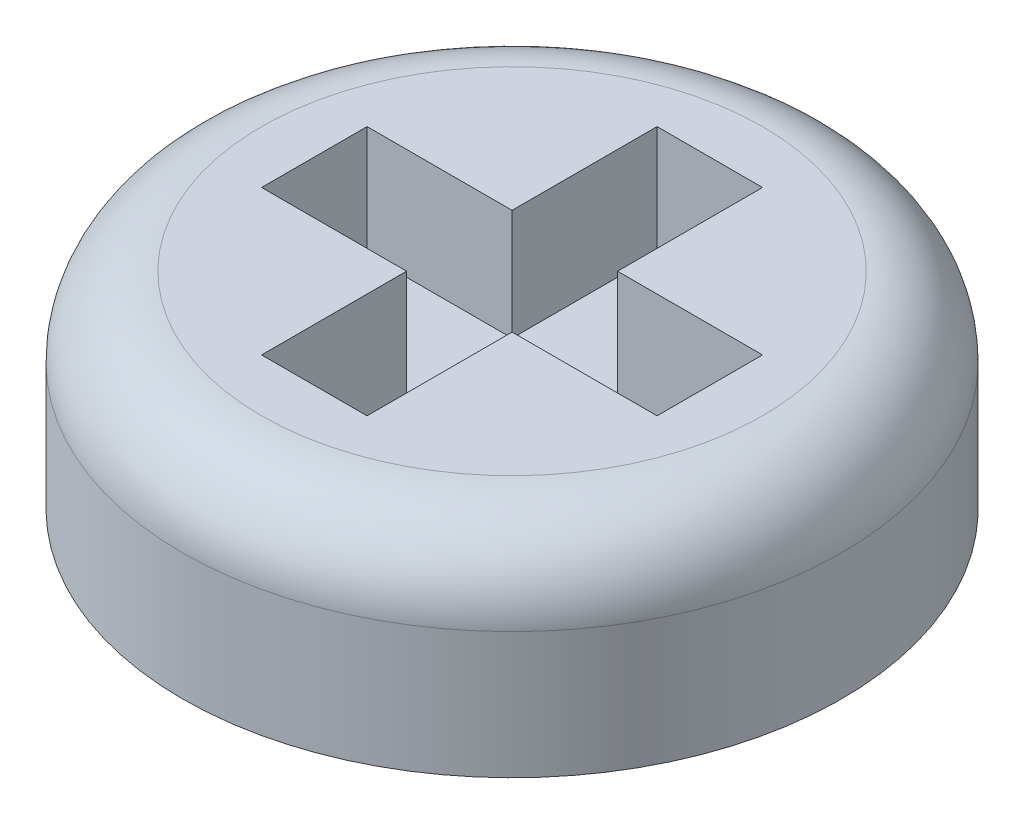
ISO-10303-21;
HEADER;
FILE_DESCRIPTION(('STEP AP214'),'2;1');
FILE_NAME('part.step','',(''),(''),'','','');
FILE_SCHEMA(('AUTOMOTIVE_DESIGN { 1 0 10303 214 1 1 1 1 }'));
ENDSEC;
DATA;
#1=APPLICATION_CONTEXT('core data for automotive mechanical design processes');
#2=APPLICATION_PROTOCOL_DEFINITION('international standard','automotive_design',2000,#1);
#3=PRODUCT_CONTEXT('',#1,'mechanical');
#4=PRODUCT('Part','Part','',(#3));
#5=PRODUCT_RELATED_PRODUCT_CATEGORY('part','',(#4));
#6=PRODUCT_DEFINITION_FORMATION('','',#4);
#7=PRODUCT_DEFINITION_CONTEXT('part definition',#1,'design');
#8=PRODUCT_DEFINITION('design','',#6,#7);
#9=PRODUCT_DEFINITION_SHAPE('','',#8);
#10=(LENGTH_UNIT() NAMED_UNIT(*) SI_UNIT(.MILLI.,.METRE.));
#11=(NAMED_UNIT(*) PLANE_ANGLE_UNIT() SI_UNIT($,.RADIAN.));
#12=(NAMED_UNIT(*) SI_UNIT($,.STERADIAN.) SOLID_ANGLE_UNIT());
#13=UNCERTAINTY_MEASURE_WITH_UNIT(LENGTH_MEASURE(1.E-05),#10,'distance_accuracy_value','');
#14=(GEOMETRIC_REPRESENTATION_CONTEXT(3) GLOBAL_UNCERTAINTY_ASSIGNED_CONTEXT((#13)) GLOBAL_UNIT_ASSIGNED_CONTEXT((#10,
#11,#12)) REPRESENTATION_CONTEXT('',''));
#15=CARTESIAN_POINT('',(0.,0.,0.));
#16=DIRECTION('',(0.,0.,1.));
#17=DIRECTION('',(1.,0.,0.));
#18=AXIS2_PLACEMENT_3D('',#15,#16,#17);
#19=CARTESIAN_POINT('',(0.508,35.0012,1.905));
#20=DIRECTION('',(1.,0.,0.));
#21=DIRECTION('',(0.,1.,0.));
#22=AXIS2_PLACEMENT_3D('',#19,#20,#21);
#23=PLANE('',#22);
#24=DIRECTION('',(-2.54151269345114E-13,0.,-1.));
#25=VECTOR('',#24,1.);
#26=CARTESIAN_POINT('',(0.508000000254,36.068000000254,1.90500000016934));
#27=LINE('',#26,#25);
#28=CARTESIAN_POINT('',(0.508000000169333,36.0680000001693,1.90500000016934));
#29=VERTEX_POINT('',#28);
#30=CARTESIAN_POINT('',(0.508000000169215,36.0680000001693,0.508000000169333));
#31=VERTEX_POINT('',#30);
#32=EDGE_CURVE('E122',#29,#31,#27,.T.);
#33=ORIENTED_EDGE('',*,*,#32,.T.);
#34=DIRECTION('',(0.,1.,0.));
#35=VECTOR('',#34,1.);
#36=CARTESIAN_POINT('',(0.508000000254,35.0012000001693,0.508000000254));
#37=LINE('',#36,#35);
#38=CARTESIAN_POINT('',(0.508000000169215,35.0012000001693,0.508000000169333));
#39=VERTEX_POINT('',#38);
#40=EDGE_CURVE('E110',#39,#31,#37,.T.);
#41=ORIENTED_EDGE('',*,*,#40,.F.);
#42=DIRECTION('',(-2.54151269345114E-13,0.,-1.));
#43=VECTOR('',#42,1.);
#44=CARTESIAN_POINT('',(0.508000000254,35.001200000254,1.90500000016934));
#45=LINE('',#44,#43);
#46=CARTESIAN_POINT('',(0.508000000169333,35.0012000001693,1.90500000016934));
#47=VERTEX_POINT('',#46);
#48=EDGE_CURVE('E121',#47,#39,#45,.T.);
#49=ORIENTED_EDGE('',*,*,#48,.F.);
#50=DIRECTION('',(0.,1.,0.));
#51=VECTOR('',#50,1.);
#52=CARTESIAN_POINT('',(0.508000000254,35.0012000001693,1.905000000254));
#53=LINE('',#52,#51);
#54=EDGE_CURVE('E137',#47,#29,#53,.T.);
#55=ORIENTED_EDGE('',*,*,#54,.T.);
#56=EDGE_LOOP('',(#33,#41,#49,#55));
#57=FACE_BOUND('',#56,.T.);
#58=ADVANCED_FACE('F17',(#57),#23,.F.);
#59=CARTESIAN_POINT('',(0.,36.068,0.));
#60=DIRECTION('',(0.,1.,0.));
#61=DIRECTION('',(1.,0.,0.));
#62=AXIS2_PLACEMENT_3D('',#59,#60,#61);
#63=PLANE('',#62);
#64=DIRECTION('',(2.54071797403481E-13,0.,1.));
#65=VECTOR('',#64,1.);
#66=CARTESIAN_POINT('',(-0.508000000254355,36.068000000254,0.508));
#67=LINE('',#66,#65);
#68=CARTESIAN_POINT('',(-0.508,36.068,0.508));
#69=VERTEX_POINT('',#68);
#70=CARTESIAN_POINT('',(-0.508,36.068,1.905));
#71=VERTEX_POINT('',#70);
#72=EDGE_CURVE('E154',#69,#71,#67,.T.);
#73=ORIENTED_EDGE('',*,*,#72,.F.);
#74=DIRECTION('',(1.,0.,0.));
#75=VECTOR('',#74,1.);
#76=CARTESIAN_POINT('',(-1.905,36.068000000254,0.508000000254));
#77=LINE('',#76,#75);
#78=CARTESIAN_POINT('',(-1.905,36.068,0.508));
#79=VERTEX_POINT('',#78);
#80=EDGE_CURVE('E159',#79,#69,#77,.T.);
#81=ORIENTED_EDGE('',*,*,#80,.F.);
#82=DIRECTION('',(0.,0.,1.));
#83=VECTOR('',#82,1.);
#84=CARTESIAN_POINT('',(-1.905000000254,36.068000000254,-0.508));
#85=LINE('',#84,#83);
#86=CARTESIAN_POINT('',(-1.905,36.068,-0.508));
#87=VERTEX_POINT('',#86);
#88=EDGE_CURVE('E164',#87,#79,#85,.T.);
#89=ORIENTED_EDGE('',*,*,#88,.F.);
#90=DIRECTION('',(-1.,0.,-2.54071797434277E-13));
#91=VECTOR('',#90,1.);
#92=CARTESIAN_POINT('',(-0.508000000169333,36.068000000254,-0.508000000253645));
#93=LINE('',#92,#91);
#94=CARTESIAN_POINT('',(-0.508000000169333,36.0680000001693,-0.508000000169215));
#95=VERTEX_POINT('',#94);
#96=EDGE_CURVE('E169',#95,#87,#93,.T.);
#97=ORIENTED_EDGE('',*,*,#96,.F.);
#98=DIRECTION('',(0.,0.,1.));
#99=VECTOR('',#98,1.);
#100=CARTESIAN_POINT('',(-0.508000000254,36.068000000254,-1.90500000016934));
#101=LINE('',#100,#99);
#102=CARTESIAN_POINT('',(-0.508000000169333,36.0680000001693,-1.90500000016934));
#103=VERTEX_POINT('',#102);
#104=EDGE_CURVE('E174',#103,#95,#101,.T.);
#105=ORIENTED_EDGE('',*,*,#104,.F.);
#106=DIRECTION('',(-1.,0.,2.5417113724577E-13));
#107=VECTOR('',#106,1.);
#108=CARTESIAN_POINT('',(0.508000000169452,36.068000000254,-1.90500000025426));
#109=LINE('',#108,#107);
#110=CARTESIAN_POINT('',(0.508000000169452,36.0680000001693,-1.90500000016942));
#111=VERTEX_POINT('',#110);
#112=EDGE_CURVE('E179',#111,#103,#109,.T.);
#113=ORIENTED_EDGE('',*,*,#112,.F.);
#114=DIRECTION('',(2.54230741286733E-13,0.,-1.));
#115=VECTOR('',#114,1.);
#116=CARTESIAN_POINT('',(0.508000000254,36.068000000254,-0.508000000169333));
#117=LINE('',#116,#115);
#118=CARTESIAN_POINT('',(0.508000000169333,36.0680000001693,-0.508000000169333));
#119=VERTEX_POINT('',#118);
#120=EDGE_CURVE('E184',#119,#111,#117,.T.);
#121=ORIENTED_EDGE('',*,*,#120,.F.);
#122=DIRECTION('',(-1.,0.,2.5407179740348E-13));
#123=VECTOR('',#122,1.);
#124=CARTESIAN_POINT('',(1.90500000016934,36.068000000254,-0.508000000254355));
#125=LINE('',#124,#123);
#126=CARTESIAN_POINT('',(1.90500000016934,36.0680000001693,-0.508000000169452));
#127=VERTEX_POINT('',#126);
#128=EDGE_CURVE('E189',#127,#119,#125,.T.);
#129=ORIENTED_EDGE('',*,*,#128,.F.);
#130=DIRECTION('',(0.,0.,-1.));
#131=VECTOR('',#130,1.);
#132=CARTESIAN_POINT('',(1.905000000254,36.068000000254,0.508000000169215));
#133=LINE('',#132,#131);
#134=CARTESIAN_POINT('',(1.90500000016934,36.0680000001693,0.508000000169215));
#135=VERTEX_POINT('',#134);
#136=EDGE_CURVE('E132',#135,#127,#133,.T.);
#137=ORIENTED_EDGE('',*,*,#136,.F.);
#138=DIRECTION('',(1.,0.,-2.54071797403459E-13));
#139=VECTOR('',#138,1.);
#140=CARTESIAN_POINT('',(0.508000000169215,36.068000000254,0.508000000254));
#141=LINE('',#140,#139);
#142=EDGE_CURVE('E114',#31,#135,#141,.T.);
#143=ORIENTED_EDGE('',*,*,#142,.F.);
#144=ORIENTED_EDGE('',*,*,#32,.F.);
#145=DIRECTION('',(1.,0.,0.));
#146=VECTOR('',#145,1.);
#147=CARTESIAN_POINT('',(-0.508,36.068000000254,1.905000000254));
#148=LINE('',#147,#146);
#149=EDGE_CURVE('E134',#71,#29,#148,.T.);
#150=ORIENTED_EDGE('',*,*,#149,.F.);
#151=EDGE_LOOP('',(#73,#81,#89,#97,#105,#113,#121,#129,#137,#143,#144,#150));
#152=FACE_BOUND('',#151,.T.);
#153=CARTESIAN_POINT('',(0.,36.068,0.));
#154=DIRECTION('',(0.,1.,0.));
#155=DIRECTION('',(0.,0.,1.));
#156=AXIS2_PLACEMENT_3D('',#153,#154,#155);
#157=CIRCLE('',#156,2.413);
#158=CARTESIAN_POINT('',(0.,36.068,2.413));
#159=VERTEX_POINT('',#158);
#160=EDGE_CURVE('E204',#159,#159,#157,.T.);
#161=ORIENTED_EDGE('',*,*,#160,.T.);
#162=EDGE_LOOP('',(#161));
#163=FACE_BOUND('',#162,.T.);
#164=ADVANCED_FACE('F128',(#152,#163),#63,.T.);
#165=CARTESIAN_POINT('',(-1.905,35.0012,0.508));
#166=DIRECTION('',(0.,0.,1.));
#167=DIRECTION('',(1.,0.,0.));
#168=AXIS2_PLACEMENT_3D('',#165,#166,#167);
#169=PLANE('',#168);
#170=ORIENTED_EDGE('',*,*,#142,.T.);
#171=DIRECTION('',(0.,1.,0.));
#172=VECTOR('',#171,1.);
#173=CARTESIAN_POINT('',(1.905000000254,35.0012000001693,0.508000000254));
#174=LINE('',#173,#172);
#175=CARTESIAN_POINT('',(1.90500000016934,35.0012000001693,0.508000000169215));
#176=VERTEX_POINT('',#175);
#177=EDGE_CURVE('E210',#176,#135,#174,.T.);
#178=ORIENTED_EDGE('',*,*,#177,.F.);
#179=DIRECTION('',(1.,0.,-2.54071797403459E-13));
#180=VECTOR('',#179,1.);
#181=CARTESIAN_POINT('',(0.508000000169215,35.001200000254,0.508000000254));
#182=LINE('',#181,#180);
#183=EDGE_CURVE('E116',#39,#176,#182,.T.);
#184=ORIENTED_EDGE('',*,*,#183,.F.);
#185=ORIENTED_EDGE('',*,*,#40,.T.);
#186=EDGE_LOOP('',(#170,#178,#184,#185));
#187=FACE_BOUND('',#186,.T.);
#188=ADVANCED_FACE('F112',(#187),#169,.F.);
#189=CARTESIAN_POINT('',(0.,35.0012,0.));
#190=DIRECTION('',(0.,-1.,0.));
#191=DIRECTION('',(0.,0.,-1.));
#192=AXIS2_PLACEMENT_3D('',#189,#190,#191);
#193=PLANE('',#192);
#194=DIRECTION('',(2.54071797403481E-13,0.,1.));
#195=VECTOR('',#194,1.);
#196=CARTESIAN_POINT('',(-0.508000000254355,35.001200000254,0.508));
#197=LINE('',#196,#195);
#198=CARTESIAN_POINT('',(-0.508,35.0012,0.508));
#199=VERTEX_POINT('',#198);
#200=CARTESIAN_POINT('',(-0.508,35.0012,1.905));
#201=VERTEX_POINT('',#200);
#202=EDGE_CURVE('E217',#199,#201,#197,.T.);
#203=ORIENTED_EDGE('',*,*,#202,.T.);
#204=DIRECTION('',(1.,0.,0.));
#205=VECTOR('',#204,1.);
#206=CARTESIAN_POINT('',(-0.508,35.001200000254,1.905000000254));
#207=LINE('',#206,#205);
#208=EDGE_CURVE('E223',#201,#47,#207,.T.);
#209=ORIENTED_EDGE('',*,*,#208,.T.);
#210=ORIENTED_EDGE('',*,*,#48,.T.);
#211=ORIENTED_EDGE('',*,*,#183,.T.);
#212=DIRECTION('',(0.,0.,-1.));
#213=VECTOR('',#212,1.);
#214=CARTESIAN_POINT('',(1.905000000254,35.001200000254,0.508000000169215));
#215=LINE('',#214,#213);
#216=CARTESIAN_POINT('',(1.90500000016934,35.0012000001693,-0.508000000169452));
#217=VERTEX_POINT('',#216);
#218=EDGE_CURVE('E229',#176,#217,#215,.T.);
#219=ORIENTED_EDGE('',*,*,#218,.T.);
#220=DIRECTION('',(-1.,0.,2.5407179740348E-13));
#221=VECTOR('',#220,1.);
#222=CARTESIAN_POINT('',(1.90500000016934,35.001200000254,-0.508000000254355));
#223=LINE('',#222,#221);
#224=CARTESIAN_POINT('',(0.508000000169333,35.0012000001693,-0.508000000169333));
#225=VERTEX_POINT('',#224);
#226=EDGE_CURVE('E235',#217,#225,#223,.T.);
#227=ORIENTED_EDGE('',*,*,#226,.T.);
#228=DIRECTION('',(2.54230741286733E-13,0.,-1.));
#229=VECTOR('',#228,1.);
#230=CARTESIAN_POINT('',(0.508000000254,35.001200000254,-0.508000000169333));
#231=LINE('',#230,#229);
#232=CARTESIAN_POINT('',(0.508000000169452,35.0012000001693,-1.90500000016942));
#233=VERTEX_POINT('',#232);
#234=EDGE_CURVE('E241',#225,#233,#231,.T.);
#235=ORIENTED_EDGE('',*,*,#234,.T.);
#236=DIRECTION('',(-1.,0.,2.5417113724577E-13));
#237=VECTOR('',#236,1.);
#238=CARTESIAN_POINT('',(0.508000000169452,35.001200000254,-1.90500000025426));
#239=LINE('',#238,#237);
#240=CARTESIAN_POINT('',(-0.508000000169333,35.0012000001693,-1.90500000016934));
#241=VERTEX_POINT('',#240);
#242=EDGE_CURVE('E247',#233,#241,#239,.T.);
#243=ORIENTED_EDGE('',*,*,#242,.T.);
#244=DIRECTION('',(0.,0.,1.));
#245=VECTOR('',#244,1.);
#246=CARTESIAN_POINT('',(-0.508000000254,35.001200000254,-1.90500000016934));
#247=LINE('',#246,#245);
#248=CARTESIAN_POINT('',(-0.508000000169333,35.0012000001693,-0.508000000169215));
#249=VERTEX_POINT('',#248);
#250=EDGE_CURVE('E253',#241,#249,#247,.T.);
#251=ORIENTED_EDGE('',*,*,#250,.T.);
#252=DIRECTION('',(-1.,0.,-2.54071797434277E-13));
#253=VECTOR('',#252,1.);
#254=CARTESIAN_POINT('',(-0.508000000169333,35.001200000254,-0.508000000253645));
#255=LINE('',#254,#253);
#256=CARTESIAN_POINT('',(-1.905,35.0012,-0.508));
#257=VERTEX_POINT('',#256);
#258=EDGE_CURVE('E259',#249,#257,#255,.T.);
#259=ORIENTED_EDGE('',*,*,#258,.T.);
#260=DIRECTION('',(0.,0.,1.));
#261=VECTOR('',#260,1.);
#262=CARTESIAN_POINT('',(-1.905000000254,35.001200000254,-0.508));
#263=LINE('',#262,#261);
#264=CARTESIAN_POINT('',(-1.905,35.0012,0.508));
#265=VERTEX_POINT('',#264);
#266=EDGE_CURVE('E265',#257,#265,#263,.T.);
#267=ORIENTED_EDGE('',*,*,#266,.T.);
#268=DIRECTION('',(1.,0.,0.));
#269=VECTOR('',#268,1.);
#270=CARTESIAN_POINT('',(-1.905,35.001200000254,0.508000000254));
#271=LINE('',#270,#269);
#272=EDGE_CURVE('E270',#265,#199,#271,.T.);
#273=ORIENTED_EDGE('',*,*,#272,.T.);
#274=EDGE_LOOP('',(#203,#209,#210,#211,#219,#227,#235,#243,#251,#259,#267,#273));
#275=FACE_BOUND('',#274,.T.);
#276=ADVANCED_FACE('F381',(#275),#193,.F.);
#277=CARTESIAN_POINT('',(-0.508,35.0012,1.905));
#278=DIRECTION('',(0.,0.,1.));
#279=DIRECTION('',(1.,0.,0.));
#280=AXIS2_PLACEMENT_3D('',#277,#278,#279);
#281=PLANE('',#280);
#282=ORIENTED_EDGE('',*,*,#149,.T.);
#283=ORIENTED_EDGE('',*,*,#54,.F.);
#284=ORIENTED_EDGE('',*,*,#208,.F.);
#285=DIRECTION('',(0.,1.,0.));
#286=VECTOR('',#285,1.);
#287=CARTESIAN_POINT('',(-0.508000000254,35.0012,1.905000000254));
#288=LINE('',#287,#286);
#289=EDGE_CURVE('E275',#201,#71,#288,.T.);
#290=ORIENTED_EDGE('',*,*,#289,.T.);
#291=EDGE_LOOP('',(#282,#283,#284,#290));
#292=FACE_BOUND('',#291,.T.);
#293=ADVANCED_FACE('F390',(#292),#281,.F.);
#294=CARTESIAN_POINT('',(-0.508,35.0012,1.905));
#295=DIRECTION('',(-1.,0.,0.));
#296=DIRECTION('',(0.,1.,0.));
#297=AXIS2_PLACEMENT_3D('',#294,#295,#296);
#298=PLANE('',#297);
#299=ORIENTED_EDGE('',*,*,#72,.T.);
#300=ORIENTED_EDGE('',*,*,#289,.F.);
#301=ORIENTED_EDGE('',*,*,#202,.F.);
#302=DIRECTION('',(0.,1.,0.));
#303=VECTOR('',#302,1.);
#304=CARTESIAN_POINT('',(-0.508000000254,35.0012,0.508000000254));
#305=LINE('',#304,#303);
#306=EDGE_CURVE('E33',#199,#69,#305,.T.);
#307=ORIENTED_EDGE('',*,*,#306,.T.);
#308=EDGE_LOOP('',(#299,#300,#301,#307));
#309=FACE_BOUND('',#308,.T.);
#310=ADVANCED_FACE('F387',(#309),#298,.F.);
#311=ORIENTED_EDGE('',*,*,#80,.T.);
#312=ORIENTED_EDGE('',*,*,#306,.F.);
#313=ORIENTED_EDGE('',*,*,#272,.F.);
#314=DIRECTION('',(0.,1.,0.));
#315=VECTOR('',#314,1.);
#316=CARTESIAN_POINT('',(-1.905000000254,35.0012,0.508000000254));
#317=LINE('',#316,#315);
#318=EDGE_CURVE('E41',#265,#79,#317,.T.);
#319=ORIENTED_EDGE('',*,*,#318,.T.);
#320=EDGE_LOOP('',(#311,#312,#313,#319));
#321=FACE_BOUND('',#320,.T.);
#322=ADVANCED_FACE('F384',(#321),#169,.F.);
#323=CARTESIAN_POINT('',(-1.905,35.0012,0.508));
#324=DIRECTION('',(-1.,0.,0.));
#325=DIRECTION('',(0.,0.,1.));
#326=AXIS2_PLACEMENT_3D('',#323,#324,#325);
#327=PLANE('',#326);
#328=ORIENTED_EDGE('',*,*,#88,.T.);
#329=ORIENTED_EDGE('',*,*,#318,.F.);
#330=ORIENTED_EDGE('',*,*,#266,.F.);
#331=DIRECTION('',(0.,1.,0.));
#332=VECTOR('',#331,1.);
#333=CARTESIAN_POINT('',(-1.905000000254,35.0012,-0.508000000254));
#334=LINE('',#333,#332);
#335=EDGE_CURVE('E289',#257,#87,#334,.T.);
#336=ORIENTED_EDGE('',*,*,#335,.T.);
#337=EDGE_LOOP('',(#328,#329,#330,#336));
#338=FACE_BOUND('',#337,.T.);
#339=ADVANCED_FACE('F382',(#338),#327,.F.);
#340=CARTESIAN_POINT('',(-1.905,35.0012,-0.508));
#341=DIRECTION('',(0.,0.,-1.));
#342=DIRECTION('',(0.,-1.,0.));
#343=AXIS2_PLACEMENT_3D('',#340,#341,#342);
#344=PLANE('',#343);
#345=ORIENTED_EDGE('',*,*,#96,.T.);
#346=ORIENTED_EDGE('',*,*,#335,.F.);
#347=ORIENTED_EDGE('',*,*,#258,.F.);
#348=DIRECTION('',(0.,1.,0.));
#349=VECTOR('',#348,1.);
#350=CARTESIAN_POINT('',(-0.508000000254,35.0012000001693,-0.508000000254));
#351=LINE('',#350,#349);
#352=EDGE_CURVE('E295',#249,#95,#351,.T.);
#353=ORIENTED_EDGE('',*,*,#352,.T.);
#354=EDGE_LOOP('',(#345,#346,#347,#353));
#355=FACE_BOUND('',#354,.T.);
#356=ADVANCED_FACE('F365',(#355),#344,.F.);
#357=ORIENTED_EDGE('',*,*,#104,.T.);
#358=ORIENTED_EDGE('',*,*,#352,.F.);
#359=ORIENTED_EDGE('',*,*,#250,.F.);
#360=DIRECTION('',(0.,1.,0.));
#361=VECTOR('',#360,1.);
#362=CARTESIAN_POINT('',(-0.508000000254,35.0012000001693,-1.905000000254));
#363=LINE('',#362,#361);
#364=EDGE_CURVE('E301',#241,#103,#363,.T.);
#365=ORIENTED_EDGE('',*,*,#364,.T.);
#366=EDGE_LOOP('',(#357,#358,#359,#365));
#367=FACE_BOUND('',#366,.T.);
#368=ADVANCED_FACE('F366',(#367),#298,.F.);
#369=CARTESIAN_POINT('',(-0.508,35.0012,-1.905));
#370=DIRECTION('',(0.,0.,-1.));
#371=DIRECTION('',(-1.,0.,0.));
#372=AXIS2_PLACEMENT_3D('',#369,#370,#371);
#373=PLANE('',#372);
#374=ORIENTED_EDGE('',*,*,#112,.T.);
#375=ORIENTED_EDGE('',*,*,#364,.F.);
#376=ORIENTED_EDGE('',*,*,#242,.F.);
#377=DIRECTION('',(0.,1.,0.));
#378=VECTOR('',#377,1.);
#379=CARTESIAN_POINT('',(0.508000000254,35.0012000001693,-1.905000000254));
#380=LINE('',#379,#378);
#381=EDGE_CURVE('E307',#233,#111,#380,.T.);
#382=ORIENTED_EDGE('',*,*,#381,.T.);
#383=EDGE_LOOP('',(#374,#375,#376,#382));
#384=FACE_BOUND('',#383,.T.);
#385=ADVANCED_FACE('F357',(#384),#373,.F.);
#386=ORIENTED_EDGE('',*,*,#120,.T.);
#387=ORIENTED_EDGE('',*,*,#381,.F.);
#388=ORIENTED_EDGE('',*,*,#234,.F.);
#389=DIRECTION('',(0.,1.,0.));
#390=VECTOR('',#389,1.);
#391=CARTESIAN_POINT('',(0.508000000254,35.0012000001693,-0.508000000254));
#392=LINE('',#391,#390);
#393=EDGE_CURVE('E313',#225,#119,#392,.T.);
#394=ORIENTED_EDGE('',*,*,#393,.T.);
#395=EDGE_LOOP('',(#386,#387,#388,#394));
#396=FACE_BOUND('',#395,.T.);
#397=ADVANCED_FACE('F351',(#396),#23,.F.);
#398=ORIENTED_EDGE('',*,*,#128,.T.);
#399=ORIENTED_EDGE('',*,*,#393,.F.);
#400=ORIENTED_EDGE('',*,*,#226,.F.);
#401=DIRECTION('',(0.,1.,0.));
#402=VECTOR('',#401,1.);
#403=CARTESIAN_POINT('',(1.905000000254,35.0012000001693,-0.508000000254));
#404=LINE('',#403,#402);
#405=EDGE_CURVE('E319',#217,#127,#404,.T.);
#406=ORIENTED_EDGE('',*,*,#405,.T.);
#407=EDGE_LOOP('',(#398,#399,#400,#406));
#408=FACE_BOUND('',#407,.T.);
#409=ADVANCED_FACE('F345',(#408),#344,.F.);
#410=CARTESIAN_POINT('',(1.905,35.0012,0.508));
#411=DIRECTION('',(1.,0.,0.));
#412=DIRECTION('',(0.,1.,0.));
#413=AXIS2_PLACEMENT_3D('',#410,#411,#412);
#414=PLANE('',#413);
#415=ORIENTED_EDGE('',*,*,#136,.T.);
#416=ORIENTED_EDGE('',*,*,#405,.F.);
#417=ORIENTED_EDGE('',*,*,#218,.F.);
#418=ORIENTED_EDGE('',*,*,#177,.T.);
#419=EDGE_LOOP('',(#415,#416,#417,#418));
#420=FACE_BOUND('',#419,.T.);
#421=ADVANCED_FACE('F336',(#420),#414,.F.);
#422=CARTESIAN_POINT('',(0.,35.306,0.));
#423=DIRECTION('',(0.,1.,0.));
#424=DIRECTION('',(0.,0.,1.));
#425=AXIS2_PLACEMENT_3D('',#422,#423,#424);
#426=TOROIDAL_SURFACE('',#425,2.413,0.762);
#427=ORIENTED_EDGE('',*,*,#160,.F.);
#428=EDGE_LOOP('',(#427));
#429=FACE_BOUND('',#428,.T.);
#430=CARTESIAN_POINT('',(0.,35.306000000254,0.));
#431=DIRECTION('',(0.,-1.,0.));
#432=DIRECTION('',(0.,0.,1.));
#433=AXIS2_PLACEMENT_3D('',#430,#431,#432);
#434=CIRCLE('',#433,3.175);
#435=CARTESIAN_POINT('',(0.,35.306000000254,3.175));
#436=VERTEX_POINT('',#435);
#437=EDGE_CURVE('E26',#436,#436,#434,.T.);
#438=ORIENTED_EDGE('',*,*,#437,.F.);
#439=EDGE_LOOP('',(#438));
#440=FACE_BOUND('',#439,.T.);
#441=ADVANCED_FACE('F334',(#429,#440),#426,.T.);
#442=CARTESIAN_POINT('',(0.,36.068,0.));
#443=DIRECTION('',(0.,1.,0.));
#444=DIRECTION('',(0.,0.,-1.));
#445=AXIS2_PLACEMENT_3D('',#442,#443,#444);
#446=CYLINDRICAL_SURFACE('',#445,3.175);
#447=CARTESIAN_POINT('',(0.,34.0868,0.));
#448=DIRECTION('',(0.,1.,0.));
#449=DIRECTION('',(0.,0.,1.));
#450=AXIS2_PLACEMENT_3D('',#447,#448,#449);
#451=CIRCLE('',#450,3.175);
#452=CARTESIAN_POINT('',(0.,34.0868,3.175));
#453=VERTEX_POINT('',#452);
#454=EDGE_CURVE('E11',#453,#453,#451,.T.);
#455=ORIENTED_EDGE('',*,*,#454,.T.);
#456=EDGE_LOOP('',(#455));
#457=FACE_BOUND('',#456,.T.);
#458=ORIENTED_EDGE('',*,*,#437,.T.);
#459=EDGE_LOOP('',(#458));
#460=FACE_BOUND('',#459,.T.);
#461=ADVANCED_FACE('F332',(#457,#460),#446,.T.);
#462=CARTESIAN_POINT('',(0.,34.0868,0.));
#463=DIRECTION('',(0.,1.,0.));
#464=DIRECTION('',(1.,0.,0.));
#465=AXIS2_PLACEMENT_3D('',#462,#463,#464);
#466=PLANE('',#465);
#467=ORIENTED_EDGE('',*,*,#454,.F.);
#468=EDGE_LOOP('',(#467));
#469=FACE_BOUND('',#468,.T.);
#470=ADVANCED_FACE('F19',(#469),#466,.F.);
#471=CLOSED_SHELL('',(#58,#164,#188,#276,#293,#310,#322,#339,#356,#368,#385,#397,#409,#421,#441,
#461,#470));
#472=MANIFOLD_SOLID_BREP('B1',#471);
#473=ADVANCED_BREP_SHAPE_REPRESENTATION('',(#18,#472),#14);
#474=SHAPE_DEFINITION_REPRESENTATION(#9,#473);
ENDSEC;
END-ISO-10303-21;
